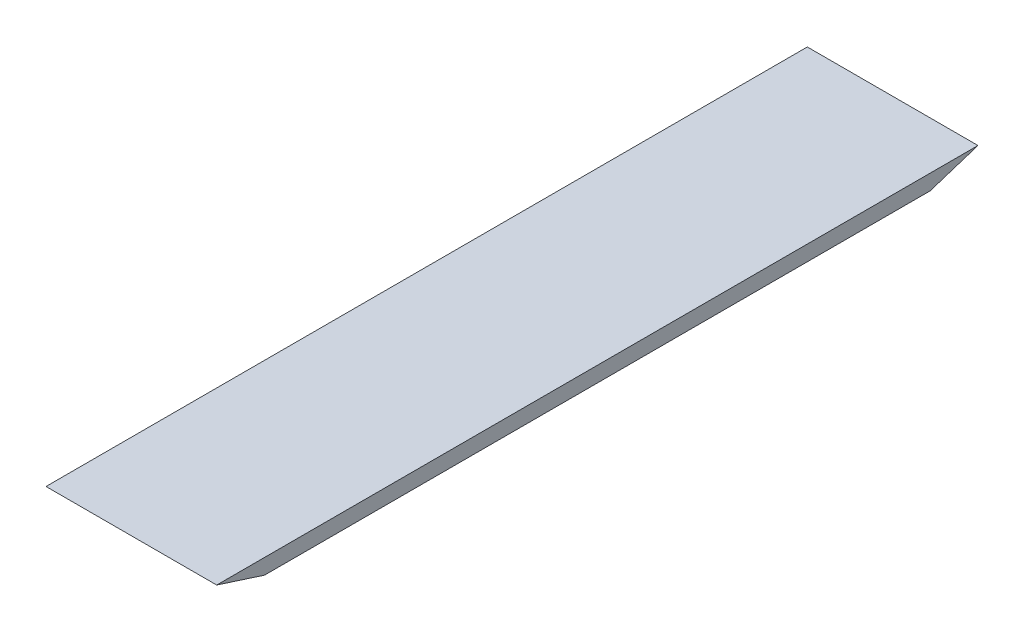
ISO-10303-21;
HEADER;
FILE_DESCRIPTION(('STEP AP214'),'2;1');
FILE_NAME('part.step','',(''),(''),'','','');
FILE_SCHEMA(('AUTOMOTIVE_DESIGN { 1 0 10303 214 1 1 1 1 }'));
ENDSEC;
DATA;
#1=APPLICATION_CONTEXT('core data for automotive mechanical design processes');
#2=APPLICATION_PROTOCOL_DEFINITION('international standard','automotive_design',2000,#1);
#3=PRODUCT_CONTEXT('',#1,'mechanical');
#4=PRODUCT('Part','Part','',(#3));
#5=PRODUCT_RELATED_PRODUCT_CATEGORY('part','',(#4));
#6=PRODUCT_DEFINITION_FORMATION('','',#4);
#7=PRODUCT_DEFINITION_CONTEXT('part definition',#1,'design');
#8=PRODUCT_DEFINITION('design','',#6,#7);
#9=PRODUCT_DEFINITION_SHAPE('','',#8);
#10=(LENGTH_UNIT() NAMED_UNIT(*) SI_UNIT(.MILLI.,.METRE.));
#11=(NAMED_UNIT(*) PLANE_ANGLE_UNIT() SI_UNIT($,.RADIAN.));
#12=(NAMED_UNIT(*) SI_UNIT($,.STERADIAN.) SOLID_ANGLE_UNIT());
#13=UNCERTAINTY_MEASURE_WITH_UNIT(LENGTH_MEASURE(1.E-05),#10,'distance_accuracy_value','');
#14=(GEOMETRIC_REPRESENTATION_CONTEXT(3) GLOBAL_UNCERTAINTY_ASSIGNED_CONTEXT((#13)) GLOBAL_UNIT_ASSIGNED_CONTEXT((#10,
#11,#12)) REPRESENTATION_CONTEXT('',''));
#15=CARTESIAN_POINT('',(0.,0.,0.));
#16=DIRECTION('',(0.,0.,1.));
#17=DIRECTION('',(1.,0.,0.));
#18=AXIS2_PLACEMENT_3D('',#15,#16,#17);
#19=CARTESIAN_POINT('',(100.,0.,-446.));
#20=DIRECTION('',(0.,-0.952028561285265,-0.30600918041312));
#21=DIRECTION('',(0.,0.30600918041312,-0.952028561285265));
#22=AXIS2_PLACEMENT_3D('',#19,#20,#21);
#23=PLANE('',#22);
#24=DIRECTION('',(0.,-0.30600918041312,0.952028561285264));
#25=VECTOR('',#24,1.);
#26=CARTESIAN_POINT('',(0.,0.,-446.));
#27=LINE('',#26,#25);
#28=CARTESIAN_POINT('',(0.,0.,-446.));
#29=VERTEX_POINT('',#28);
#30=CARTESIAN_POINT('',(0.,-8.99999999999998,-418.));
#31=VERTEX_POINT('',#30);
#32=EDGE_CURVE('E100',#29,#31,#27,.T.);
#33=ORIENTED_EDGE('',*,*,#32,.F.);
#34=DIRECTION('',(-1.,0.,0.));
#35=VECTOR('',#34,1.);
#36=CARTESIAN_POINT('',(100.,0.,-446.));
#37=LINE('',#36,#35);
#38=CARTESIAN_POINT('',(100.,0.,-446.));
#39=VERTEX_POINT('',#38);
#40=EDGE_CURVE('E11',#39,#29,#37,.T.);
#41=ORIENTED_EDGE('',*,*,#40,.F.);
#42=DIRECTION('',(0.,-0.30600918041312,0.952028561285264));
#43=VECTOR('',#42,1.);
#44=CARTESIAN_POINT('',(100.,0.,-446.));
#45=LINE('',#44,#43);
#46=CARTESIAN_POINT('',(100.,-8.99999999999998,-418.));
#47=VERTEX_POINT('',#46);
#48=EDGE_CURVE('E94',#39,#47,#45,.T.);
#49=ORIENTED_EDGE('',*,*,#48,.T.);
#50=DIRECTION('',(-1.,0.,0.));
#51=VECTOR('',#50,1.);
#52=CARTESIAN_POINT('',(100.,-8.99999999999998,-418.));
#53=LINE('',#52,#51);
#54=EDGE_CURVE('E39',#47,#31,#53,.T.);
#55=ORIENTED_EDGE('',*,*,#54,.T.);
#56=EDGE_LOOP('',(#33,#41,#49,#55));
#57=FACE_BOUND('',#56,.T.);
#58=ADVANCED_FACE('F36',(#57),#23,.T.);
#59=CARTESIAN_POINT('',(100.,0.,0.));
#60=DIRECTION('',(0.,1.,0.));
#61=DIRECTION('',(0.,0.,1.));
#62=AXIS2_PLACEMENT_3D('',#59,#60,#61);
#63=PLANE('',#62);
#64=DIRECTION('',(0.,0.,-1.));
#65=VECTOR('',#64,1.);
#66=CARTESIAN_POINT('',(0.,0.,0.));
#67=LINE('',#66,#65);
#68=CARTESIAN_POINT('',(0.,0.,0.));
#69=VERTEX_POINT('',#68);
#70=EDGE_CURVE('E96',#69,#29,#67,.T.);
#71=ORIENTED_EDGE('',*,*,#70,.F.);
#72=DIRECTION('',(-1.,0.,0.));
#73=VECTOR('',#72,1.);
#74=CARTESIAN_POINT('',(100.,0.,0.));
#75=LINE('',#74,#73);
#76=CARTESIAN_POINT('',(100.,0.,0.));
#77=VERTEX_POINT('',#76);
#78=EDGE_CURVE('E45',#77,#69,#75,.T.);
#79=ORIENTED_EDGE('',*,*,#78,.F.);
#80=DIRECTION('',(0.,0.,-1.));
#81=VECTOR('',#80,1.);
#82=CARTESIAN_POINT('',(100.,0.,0.));
#83=LINE('',#82,#81);
#84=EDGE_CURVE('E91',#77,#39,#83,.T.);
#85=ORIENTED_EDGE('',*,*,#84,.T.);
#86=ORIENTED_EDGE('',*,*,#40,.T.);
#87=EDGE_LOOP('',(#71,#79,#85,#86));
#88=FACE_BOUND('',#87,.T.);
#89=ADVANCED_FACE('F110',(#88),#63,.T.);
#90=CARTESIAN_POINT('',(100.,-9.00000000000002,-28.));
#91=DIRECTION('',(0.,-0.952028561285264,0.306009180413121));
#92=DIRECTION('',(0.,-0.306009180413121,-0.952028561285264));
#93=AXIS2_PLACEMENT_3D('',#90,#91,#92);
#94=PLANE('',#93);
#95=DIRECTION('',(0.,0.306009180413121,0.952028561285264));
#96=VECTOR('',#95,1.);
#97=CARTESIAN_POINT('',(0.,-9.00000000000002,-28.));
#98=LINE('',#97,#96);
#99=CARTESIAN_POINT('',(0.,-9.00000000000002,-28.));
#100=VERTEX_POINT('',#99);
#101=EDGE_CURVE('E86',#100,#69,#98,.T.);
#102=ORIENTED_EDGE('',*,*,#101,.F.);
#103=DIRECTION('',(-1.,0.,0.));
#104=VECTOR('',#103,1.);
#105=CARTESIAN_POINT('',(100.,-9.00000000000002,-28.));
#106=LINE('',#105,#104);
#107=CARTESIAN_POINT('',(100.,-9.00000000000002,-28.));
#108=VERTEX_POINT('',#107);
#109=EDGE_CURVE('E81',#108,#100,#106,.T.);
#110=ORIENTED_EDGE('',*,*,#109,.F.);
#111=DIRECTION('',(0.,0.306009180413121,0.952028561285264));
#112=VECTOR('',#111,1.);
#113=CARTESIAN_POINT('',(100.,-9.00000000000002,-28.));
#114=LINE('',#113,#112);
#115=EDGE_CURVE('E84',#108,#77,#114,.T.);
#116=ORIENTED_EDGE('',*,*,#115,.T.);
#117=ORIENTED_EDGE('',*,*,#78,.T.);
#118=EDGE_LOOP('',(#102,#110,#116,#117));
#119=FACE_BOUND('',#118,.T.);
#120=ADVANCED_FACE('F83',(#119),#94,.T.);
#121=CARTESIAN_POINT('',(100.,-8.99999999999998,-418.));
#122=DIRECTION('',(0.,-1.,0.));
#123=DIRECTION('',(0.,0.,-1.));
#124=AXIS2_PLACEMENT_3D('',#121,#122,#123);
#125=PLANE('',#124);
#126=DIRECTION('',(0.,0.,1.));
#127=VECTOR('',#126,1.);
#128=CARTESIAN_POINT('',(0.,-8.99999999999998,-418.));
#129=LINE('',#128,#127);
#130=EDGE_CURVE('E103',#31,#100,#129,.T.);
#131=ORIENTED_EDGE('',*,*,#130,.F.);
#132=ORIENTED_EDGE('',*,*,#54,.F.);
#133=DIRECTION('',(0.,0.,1.));
#134=VECTOR('',#133,1.);
#135=CARTESIAN_POINT('',(100.,-8.99999999999998,-418.));
#136=LINE('',#135,#134);
#137=EDGE_CURVE('E90',#47,#108,#136,.T.);
#138=ORIENTED_EDGE('',*,*,#137,.T.);
#139=ORIENTED_EDGE('',*,*,#109,.T.);
#140=EDGE_LOOP('',(#131,#132,#138,#139));
#141=FACE_BOUND('',#140,.T.);
#142=ADVANCED_FACE('F93',(#141),#125,.T.);
#143=CARTESIAN_POINT('',(100.,0.,0.));
#144=DIRECTION('',(-1.,0.,0.));
#145=DIRECTION('',(0.,0.,1.));
#146=AXIS2_PLACEMENT_3D('',#143,#144,#145);
#147=PLANE('',#146);
#148=ORIENTED_EDGE('',*,*,#48,.F.);
#149=ORIENTED_EDGE('',*,*,#84,.F.);
#150=ORIENTED_EDGE('',*,*,#115,.F.);
#151=ORIENTED_EDGE('',*,*,#137,.F.);
#152=EDGE_LOOP('',(#148,#149,#150,#151));
#153=FACE_BOUND('',#152,.T.);
#154=ADVANCED_FACE('F89',(#153),#147,.F.);
#155=CARTESIAN_POINT('',(0.,0.,0.));
#156=DIRECTION('',(-1.,0.,0.));
#157=DIRECTION('',(0.,0.,1.));
#158=AXIS2_PLACEMENT_3D('',#155,#156,#157);
#159=PLANE('',#158);
#160=ORIENTED_EDGE('',*,*,#32,.T.);
#161=ORIENTED_EDGE('',*,*,#130,.T.);
#162=ORIENTED_EDGE('',*,*,#101,.T.);
#163=ORIENTED_EDGE('',*,*,#70,.T.);
#164=EDGE_LOOP('',(#160,#161,#162,#163));
#165=FACE_BOUND('',#164,.T.);
#166=ADVANCED_FACE('F109',(#165),#159,.T.);
#167=CLOSED_SHELL('',(#58,#89,#120,#142,#154,#166));
#168=MANIFOLD_SOLID_BREP('B2',#167);
#169=ADVANCED_BREP_SHAPE_REPRESENTATION('',(#18,#168),#14);
#170=SHAPE_DEFINITION_REPRESENTATION(#9,#169);
ENDSEC;
END-ISO-10303-21;
